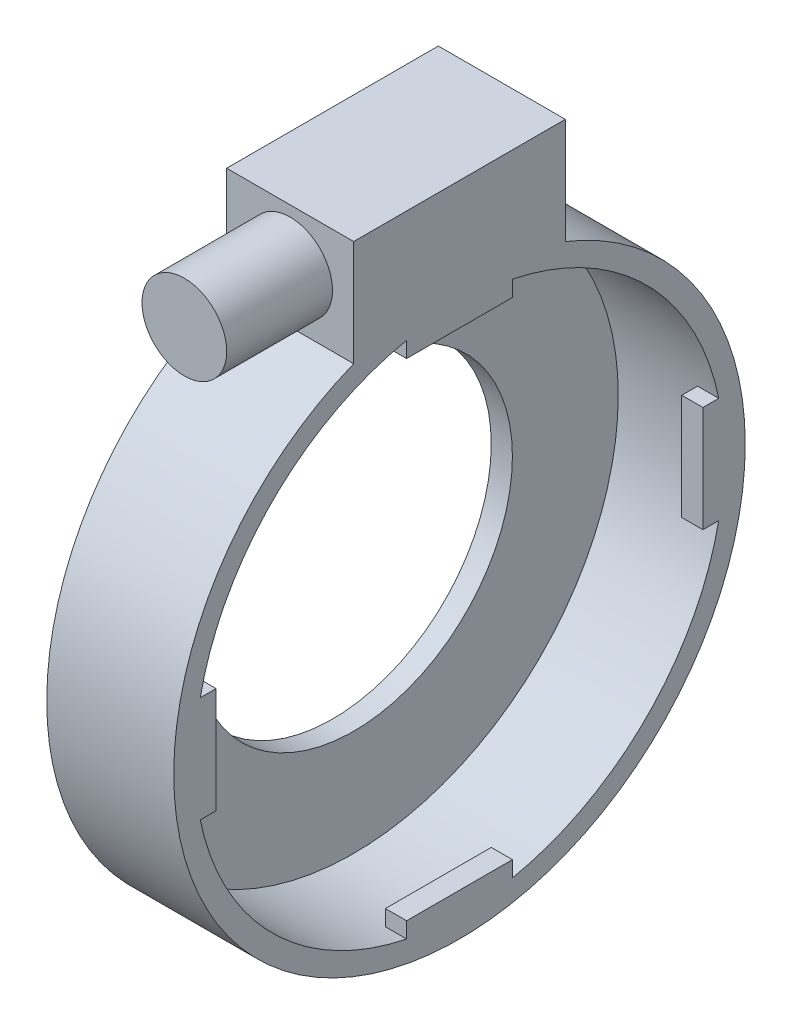
ISO-10303-21;
HEADER;
FILE_DESCRIPTION(('STEP AP214'),'2;1');
FILE_NAME('part.step','',(''),(''),'','','');
FILE_SCHEMA(('AUTOMOTIVE_DESIGN { 1 0 10303 214 1 1 1 1 }'));
ENDSEC;
DATA;
#1=APPLICATION_CONTEXT('core data for automotive mechanical design processes');
#2=APPLICATION_PROTOCOL_DEFINITION('international standard','automotive_design',2000,#1);
#3=PRODUCT_CONTEXT('',#1,'mechanical');
#4=PRODUCT('Part','Part','',(#3));
#5=PRODUCT_RELATED_PRODUCT_CATEGORY('part','',(#4));
#6=PRODUCT_DEFINITION_FORMATION('','',#4);
#7=PRODUCT_DEFINITION_CONTEXT('part definition',#1,'design');
#8=PRODUCT_DEFINITION('design','',#6,#7);
#9=PRODUCT_DEFINITION_SHAPE('','',#8);
#10=(LENGTH_UNIT() NAMED_UNIT(*) SI_UNIT(.MILLI.,.METRE.));
#11=(NAMED_UNIT(*) PLANE_ANGLE_UNIT() SI_UNIT($,.RADIAN.));
#12=(NAMED_UNIT(*) SI_UNIT($,.STERADIAN.) SOLID_ANGLE_UNIT());
#13=UNCERTAINTY_MEASURE_WITH_UNIT(LENGTH_MEASURE(1.E-05),#10,'distance_accuracy_value','');
#14=(GEOMETRIC_REPRESENTATION_CONTEXT(3) GLOBAL_UNCERTAINTY_ASSIGNED_CONTEXT((#13)) GLOBAL_UNIT_ASSIGNED_CONTEXT((#10,
#11,#12)) REPRESENTATION_CONTEXT('',''));
#15=CARTESIAN_POINT('',(0.,0.,0.));
#16=DIRECTION('',(0.,0.,1.));
#17=DIRECTION('',(1.,0.,0.));
#18=AXIS2_PLACEMENT_3D('',#15,#16,#17);
#19=CARTESIAN_POINT('',(12.,0.,0.));
#20=DIRECTION('',(-1.,0.,0.));
#21=DIRECTION('',(0.,0.,1.));
#22=AXIS2_PLACEMENT_3D('',#19,#20,#21);
#23=CYLINDRICAL_SURFACE('',#22,15.);
#24=CARTESIAN_POINT('',(0.,0.,0.));
#25=DIRECTION('',(1.,0.,0.));
#26=DIRECTION('',(0.,0.,-1.));
#27=AXIS2_PLACEMENT_3D('',#24,#25,#26);
#28=CIRCLE('',#27,15.);
#29=CARTESIAN_POINT('',(0.,0.,-15.));
#30=VERTEX_POINT('',#29);
#31=EDGE_CURVE('E312',#30,#30,#28,.T.);
#32=ORIENTED_EDGE('',*,*,#31,.F.);
#33=EDGE_LOOP('',(#32));
#34=FACE_BOUND('',#33,.T.);
#35=CARTESIAN_POINT('',(2.,0.,0.));
#36=DIRECTION('',(1.,0.,0.));
#37=DIRECTION('',(0.,0.,-1.));
#38=AXIS2_PLACEMENT_3D('',#35,#36,#37);
#39=CIRCLE('',#38,15.);
#40=CARTESIAN_POINT('',(2.,0.,-15.));
#41=VERTEX_POINT('',#40);
#42=EDGE_CURVE('E308',#41,#41,#39,.T.);
#43=ORIENTED_EDGE('',*,*,#42,.T.);
#44=EDGE_LOOP('',(#43));
#45=FACE_BOUND('',#44,.T.);
#46=ADVANCED_FACE('F37',(#34,#45),#23,.F.);
#47=CARTESIAN_POINT('',(12.,0.,0.));
#48=DIRECTION('',(1.,0.,0.));
#49=DIRECTION('',(0.,0.,-1.));
#50=AXIS2_PLACEMENT_3D('',#47,#48,#49);
#51=PLANE('',#50);
#52=CARTESIAN_POINT('',(12.,0.,0.));
#53=DIRECTION('',(1.,0.,0.));
#54=DIRECTION('',(0.,0.,-1.));
#55=AXIS2_PLACEMENT_3D('',#52,#53,#54);
#56=CIRCLE('',#55,25.);
#57=CARTESIAN_POINT('',(12.,-5.,24.4948974278318));
#58=VERTEX_POINT('',#57);
#59=CARTESIAN_POINT('',(12.,-24.4948974278318,5.));
#60=VERTEX_POINT('',#59);
#61=EDGE_CURVE('E309',#58,#60,#56,.T.);
#62=ORIENTED_EDGE('',*,*,#61,.F.);
#63=DIRECTION('',(0.,0.,-1.));
#64=VECTOR('',#63,1.);
#65=CARTESIAN_POINT('',(12.,-5.,0.));
#66=LINE('',#65,#64);
#67=CARTESIAN_POINT('',(12.,-5.,23.));
#68=VERTEX_POINT('',#67);
#69=EDGE_CURVE('E275',#58,#68,#66,.T.);
#70=ORIENTED_EDGE('',*,*,#69,.T.);
#71=DIRECTION('',(0.,1.,0.));
#72=VECTOR('',#71,1.);
#73=CARTESIAN_POINT('',(12.,0.,23.));
#74=LINE('',#73,#72);
#75=CARTESIAN_POINT('',(12.,5.,23.));
#76=VERTEX_POINT('',#75);
#77=EDGE_CURVE('E263',#68,#76,#74,.T.);
#78=ORIENTED_EDGE('',*,*,#77,.T.);
#79=DIRECTION('',(0.,0.,1.));
#80=VECTOR('',#79,1.);
#81=CARTESIAN_POINT('',(12.,5.,0.));
#82=LINE('',#81,#80);
#83=CARTESIAN_POINT('',(12.,4.99999999999999,24.4948974278318));
#84=VERTEX_POINT('',#83);
#85=EDGE_CURVE('E287',#76,#84,#82,.T.);
#86=ORIENTED_EDGE('',*,*,#85,.T.);
#87=CARTESIAN_POINT('',(12.,24.4948974278318,5.));
#88=VERTEX_POINT('',#87);
#89=EDGE_CURVE('E304',#88,#84,#56,.T.);
#90=ORIENTED_EDGE('',*,*,#89,.F.);
#91=DIRECTION('',(0.,-1.,0.));
#92=VECTOR('',#91,1.);
#93=CARTESIAN_POINT('',(12.,0.,5.));
#94=LINE('',#93,#92);
#95=CARTESIAN_POINT('',(12.,23.,5.));
#96=VERTEX_POINT('',#95);
#97=EDGE_CURVE('E244',#88,#96,#94,.T.);
#98=ORIENTED_EDGE('',*,*,#97,.T.);
#99=DIRECTION('',(0.,0.,-1.));
#100=VECTOR('',#99,1.);
#101=CARTESIAN_POINT('',(12.,23.,0.));
#102=LINE('',#101,#100);
#103=CARTESIAN_POINT('',(12.,23.,-5.));
#104=VERTEX_POINT('',#103);
#105=EDGE_CURVE('E232',#96,#104,#102,.T.);
#106=ORIENTED_EDGE('',*,*,#105,.T.);
#107=DIRECTION('',(0.,1.,0.));
#108=VECTOR('',#107,1.);
#109=CARTESIAN_POINT('',(12.,0.,-5.));
#110=LINE('',#109,#108);
#111=CARTESIAN_POINT('',(12.,24.4948974278318,-5.));
#112=VERTEX_POINT('',#111);
#113=EDGE_CURVE('E256',#104,#112,#110,.T.);
#114=ORIENTED_EDGE('',*,*,#113,.T.);
#115=CARTESIAN_POINT('',(12.,5.,-24.4948974278318));
#116=VERTEX_POINT('',#115);
#117=EDGE_CURVE('E693',#116,#112,#56,.T.);
#118=ORIENTED_EDGE('',*,*,#117,.F.);
#119=DIRECTION('',(0.,0.,1.));
#120=VECTOR('',#119,1.);
#121=CARTESIAN_POINT('',(12.,5.,0.));
#122=LINE('',#121,#120);
#123=CARTESIAN_POINT('',(12.,5.,-23.));
#124=VERTEX_POINT('',#123);
#125=EDGE_CURVE('E213',#116,#124,#122,.T.);
#126=ORIENTED_EDGE('',*,*,#125,.T.);
#127=DIRECTION('',(0.,-1.,0.));
#128=VECTOR('',#127,1.);
#129=CARTESIAN_POINT('',(12.,0.,-23.));
#130=LINE('',#129,#128);
#131=CARTESIAN_POINT('',(12.,-5.,-23.));
#132=VERTEX_POINT('',#131);
#133=EDGE_CURVE('E205',#124,#132,#130,.T.);
#134=ORIENTED_EDGE('',*,*,#133,.T.);
#135=DIRECTION('',(0.,0.,-1.));
#136=VECTOR('',#135,1.);
#137=CARTESIAN_POINT('',(12.,-5.,0.));
#138=LINE('',#137,#136);
#139=CARTESIAN_POINT('',(12.,-5.,-24.4948974278318));
#140=VERTEX_POINT('',#139);
#141=EDGE_CURVE('E225',#132,#140,#138,.T.);
#142=ORIENTED_EDGE('',*,*,#141,.T.);
#143=CARTESIAN_POINT('',(12.,-24.4948974278318,-5.));
#144=VERTEX_POINT('',#143);
#145=EDGE_CURVE('E311',#144,#140,#56,.T.);
#146=ORIENTED_EDGE('',*,*,#145,.F.);
#147=DIRECTION('',(0.,1.,0.));
#148=VECTOR('',#147,1.);
#149=CARTESIAN_POINT('',(12.,0.,-5.));
#150=LINE('',#149,#148);
#151=CARTESIAN_POINT('',(12.,-23.,-5.));
#152=VERTEX_POINT('',#151);
#153=EDGE_CURVE('E194',#144,#152,#150,.T.);
#154=ORIENTED_EDGE('',*,*,#153,.T.);
#155=DIRECTION('',(0.,0.,1.));
#156=VECTOR('',#155,1.);
#157=CARTESIAN_POINT('',(12.,-23.,0.));
#158=LINE('',#157,#156);
#159=CARTESIAN_POINT('',(12.,-23.,5.));
#160=VERTEX_POINT('',#159);
#161=EDGE_CURVE('E201',#152,#160,#158,.T.);
#162=ORIENTED_EDGE('',*,*,#161,.T.);
#163=DIRECTION('',(0.,-1.,0.));
#164=VECTOR('',#163,1.);
#165=CARTESIAN_POINT('',(12.,0.,5.));
#166=LINE('',#165,#164);
#167=EDGE_CURVE('E178',#160,#60,#166,.T.);
#168=ORIENTED_EDGE('',*,*,#167,.T.);
#169=EDGE_LOOP('',(#62,#70,#78,#86,#90,#98,#106,#114,#118,#126,#134,#142,#146,#154,#162,#168));
#170=FACE_BOUND('',#169,.T.);
#171=CARTESIAN_POINT('',(12.,0.,0.));
#172=DIRECTION('',(1.,0.,0.));
#173=DIRECTION('',(0.,0.,-1.));
#174=AXIS2_PLACEMENT_3D('',#171,#172,#173);
#175=CIRCLE('',#174,27.);
#176=CARTESIAN_POINT('',(12.,25.0798724079689,10.));
#177=VERTEX_POINT('',#176);
#178=CARTESIAN_POINT('',(12.,25.0798724079689,-10.));
#179=VERTEX_POINT('',#178);
#180=EDGE_CURVE('E316',#177,#179,#175,.T.);
#181=ORIENTED_EDGE('',*,*,#180,.T.);
#182=DIRECTION('',(0.,1.,0.));
#183=VECTOR('',#182,1.);
#184=CARTESIAN_POINT('',(12.,25.0798724079689,-10.));
#185=LINE('',#184,#183);
#186=CARTESIAN_POINT('',(12.,35.0798724079689,-10.));
#187=VERTEX_POINT('',#186);
#188=EDGE_CURVE('E319',#179,#187,#185,.T.);
#189=ORIENTED_EDGE('',*,*,#188,.T.);
#190=DIRECTION('',(0.,0.,1.));
#191=VECTOR('',#190,1.);
#192=CARTESIAN_POINT('',(12.,35.0798724079689,10.));
#193=LINE('',#192,#191);
#194=CARTESIAN_POINT('',(12.,35.0798724079689,10.));
#195=VERTEX_POINT('',#194);
#196=EDGE_CURVE('E322',#187,#195,#193,.T.);
#197=ORIENTED_EDGE('',*,*,#196,.T.);
#198=DIRECTION('',(0.,-1.,0.));
#199=VECTOR('',#198,1.);
#200=CARTESIAN_POINT('',(12.,25.0798724079689,10.));
#201=LINE('',#200,#199);
#202=EDGE_CURVE('E324',#195,#177,#201,.T.);
#203=ORIENTED_EDGE('',*,*,#202,.T.);
#204=EDGE_LOOP('',(#181,#189,#197,#203));
#205=FACE_BOUND('',#204,.T.);
#206=ADVANCED_FACE('F366',(#170,#205),#51,.T.);
#207=CARTESIAN_POINT('',(0.,0.,0.));
#208=DIRECTION('',(1.,0.,0.));
#209=DIRECTION('',(0.,0.,-1.));
#210=AXIS2_PLACEMENT_3D('',#207,#208,#209);
#211=PLANE('',#210);
#212=CARTESIAN_POINT('',(0.,0.,0.));
#213=DIRECTION('',(1.,0.,0.));
#214=DIRECTION('',(0.,0.,-1.));
#215=AXIS2_PLACEMENT_3D('',#212,#213,#214);
#216=CIRCLE('',#215,27.);
#217=CARTESIAN_POINT('',(0.,25.0798724079689,10.));
#218=VERTEX_POINT('',#217);
#219=CARTESIAN_POINT('',(0.,25.0798724079689,-10.));
#220=VERTEX_POINT('',#219);
#221=EDGE_CURVE('E315',#218,#220,#216,.T.);
#222=ORIENTED_EDGE('',*,*,#221,.F.);
#223=DIRECTION('',(0.,-1.,0.));
#224=VECTOR('',#223,1.);
#225=CARTESIAN_POINT('',(0.,25.0798724079689,10.));
#226=LINE('',#225,#224);
#227=CARTESIAN_POINT('',(0.,35.0798724079689,10.));
#228=VERTEX_POINT('',#227);
#229=EDGE_CURVE('E320',#228,#218,#226,.T.);
#230=ORIENTED_EDGE('',*,*,#229,.F.);
#231=DIRECTION('',(0.,0.,1.));
#232=VECTOR('',#231,1.);
#233=CARTESIAN_POINT('',(0.,35.0798724079689,10.));
#234=LINE('',#233,#232);
#235=CARTESIAN_POINT('',(0.,35.0798724079689,-10.));
#236=VERTEX_POINT('',#235);
#237=EDGE_CURVE('E331',#236,#228,#234,.T.);
#238=ORIENTED_EDGE('',*,*,#237,.F.);
#239=DIRECTION('',(0.,1.,0.));
#240=VECTOR('',#239,1.);
#241=CARTESIAN_POINT('',(0.,25.0798724079689,-10.));
#242=LINE('',#241,#240);
#243=EDGE_CURVE('E329',#220,#236,#242,.T.);
#244=ORIENTED_EDGE('',*,*,#243,.F.);
#245=EDGE_LOOP('',(#222,#230,#238,#244));
#246=FACE_BOUND('',#245,.T.);
#247=ORIENTED_EDGE('',*,*,#31,.T.);
#248=EDGE_LOOP('',(#247));
#249=FACE_BOUND('',#248,.T.);
#250=ADVANCED_FACE('F371',(#246,#249),#211,.F.);
#251=CARTESIAN_POINT('',(12.,0.,0.));
#252=DIRECTION('',(-1.,0.,0.));
#253=DIRECTION('',(0.,0.,1.));
#254=AXIS2_PLACEMENT_3D('',#251,#252,#253);
#255=CYLINDRICAL_SURFACE('',#254,27.);
#256=ORIENTED_EDGE('',*,*,#221,.T.);
#257=DIRECTION('',(-1.,0.,0.));
#258=VECTOR('',#257,1.);
#259=CARTESIAN_POINT('',(12.,25.0798724079689,-10.));
#260=LINE('',#259,#258);
#261=EDGE_CURVE('E45',#179,#220,#260,.T.);
#262=ORIENTED_EDGE('',*,*,#261,.F.);
#263=ORIENTED_EDGE('',*,*,#180,.F.);
#264=DIRECTION('',(-1.,0.,0.));
#265=VECTOR('',#264,1.);
#266=CARTESIAN_POINT('',(12.,25.0798724079689,10.));
#267=LINE('',#266,#265);
#268=EDGE_CURVE('E326',#177,#218,#267,.T.);
#269=ORIENTED_EDGE('',*,*,#268,.T.);
#270=EDGE_LOOP('',(#256,#262,#263,#269));
#271=FACE_BOUND('',#270,.T.);
#272=ADVANCED_FACE('F39',(#271),#255,.T.);
#273=CARTESIAN_POINT('',(12.,25.0798724079689,-10.));
#274=DIRECTION('',(0.,0.,1.));
#275=DIRECTION('',(1.,0.,0.));
#276=AXIS2_PLACEMENT_3D('',#273,#274,#275);
#277=PLANE('',#276);
#278=ORIENTED_EDGE('',*,*,#243,.T.);
#279=DIRECTION('',(-1.,0.,0.));
#280=VECTOR('',#279,1.);
#281=CARTESIAN_POINT('',(12.,35.0798724079689,-10.));
#282=LINE('',#281,#280);
#283=EDGE_CURVE('E339',#187,#236,#282,.T.);
#284=ORIENTED_EDGE('',*,*,#283,.F.);
#285=ORIENTED_EDGE('',*,*,#188,.F.);
#286=ORIENTED_EDGE('',*,*,#261,.T.);
#287=EDGE_LOOP('',(#278,#284,#285,#286));
#288=FACE_BOUND('',#287,.T.);
#289=ADVANCED_FACE('F380',(#288),#277,.F.);
#290=CARTESIAN_POINT('',(12.,35.0798724079689,10.));
#291=DIRECTION('',(0.,-1.,0.));
#292=DIRECTION('',(0.,0.,-1.));
#293=AXIS2_PLACEMENT_3D('',#290,#291,#292);
#294=PLANE('',#293);
#295=ORIENTED_EDGE('',*,*,#237,.T.);
#296=DIRECTION('',(-1.,0.,0.));
#297=VECTOR('',#296,1.);
#298=CARTESIAN_POINT('',(12.,35.0798724079689,10.));
#299=LINE('',#298,#297);
#300=EDGE_CURVE('E336',#195,#228,#299,.T.);
#301=ORIENTED_EDGE('',*,*,#300,.F.);
#302=ORIENTED_EDGE('',*,*,#196,.F.);
#303=ORIENTED_EDGE('',*,*,#283,.T.);
#304=EDGE_LOOP('',(#295,#301,#302,#303));
#305=FACE_BOUND('',#304,.T.);
#306=ADVANCED_FACE('F361',(#305),#294,.F.);
#307=CARTESIAN_POINT('',(12.,25.0798724079689,10.));
#308=DIRECTION('',(0.,0.,-1.));
#309=DIRECTION('',(-1.,0.,0.));
#310=AXIS2_PLACEMENT_3D('',#307,#308,#309);
#311=PLANE('',#310);
#312=CARTESIAN_POINT('',(6.,30.0798724079689,10.));
#313=DIRECTION('',(0.,0.,-1.));
#314=DIRECTION('',(-1.,0.,0.));
#315=AXIS2_PLACEMENT_3D('',#312,#313,#314);
#316=CIRCLE('',#315,4.);
#317=CARTESIAN_POINT('',(2.,30.0798724079689,10.));
#318=VERTEX_POINT('',#317);
#319=EDGE_CURVE('E11',#318,#318,#316,.F.);
#320=ORIENTED_EDGE('',*,*,#319,.F.);
#321=EDGE_LOOP('',(#320));
#322=FACE_BOUND('',#321,.T.);
#323=ORIENTED_EDGE('',*,*,#229,.T.);
#324=ORIENTED_EDGE('',*,*,#268,.F.);
#325=ORIENTED_EDGE('',*,*,#202,.F.);
#326=ORIENTED_EDGE('',*,*,#300,.T.);
#327=EDGE_LOOP('',(#323,#324,#325,#326));
#328=FACE_BOUND('',#327,.T.);
#329=ADVANCED_FACE('F356',(#322,#328),#311,.F.);
#330=CARTESIAN_POINT('',(2.,0.,0.));
#331=DIRECTION('',(1.,0.,0.));
#332=DIRECTION('',(0.,0.,-1.));
#333=AXIS2_PLACEMENT_3D('',#330,#331,#332);
#334=CYLINDRICAL_SURFACE('',#333,25.);
#335=CARTESIAN_POINT('',(2.,0.,0.));
#336=DIRECTION('',(1.,0.,0.));
#337=DIRECTION('',(0.,0.,-1.));
#338=AXIS2_PLACEMENT_3D('',#335,#336,#337);
#339=CIRCLE('',#338,25.);
#340=CARTESIAN_POINT('',(2.,0.,-25.));
#341=VERTEX_POINT('',#340);
#342=EDGE_CURVE('E305',#341,#341,#339,.T.);
#343=ORIENTED_EDGE('',*,*,#342,.F.);
#344=EDGE_LOOP('',(#343));
#345=FACE_BOUND('',#344,.T.);
#346=CARTESIAN_POINT('',(10.,0.,0.));
#347=DIRECTION('',(1.,0.,0.));
#348=DIRECTION('',(0.,0.,-1.));
#349=AXIS2_PLACEMENT_3D('',#346,#347,#348);
#350=CIRCLE('',#349,25.);
#351=CARTESIAN_POINT('',(10.,-24.4948974278318,-5.));
#352=VERTEX_POINT('',#351);
#353=CARTESIAN_POINT('',(10.,-24.4948974278318,5.));
#354=VERTEX_POINT('',#353);
#355=EDGE_CURVE('E56',#352,#354,#350,.F.);
#356=ORIENTED_EDGE('',*,*,#355,.F.);
#357=DIRECTION('',(1.,0.,0.));
#358=VECTOR('',#357,1.);
#359=CARTESIAN_POINT('',(10.,-24.4948974278318,-5.));
#360=LINE('',#359,#358);
#361=EDGE_CURVE('E206',#352,#144,#360,.T.);
#362=ORIENTED_EDGE('',*,*,#361,.T.);
#363=ORIENTED_EDGE('',*,*,#145,.T.);
#364=DIRECTION('',(1.,0.,0.));
#365=VECTOR('',#364,1.);
#366=CARTESIAN_POINT('',(10.,-5.,-24.4948974278318));
#367=LINE('',#366,#365);
#368=CARTESIAN_POINT('',(10.,-5.,-24.4948974278318));
#369=VERTEX_POINT('',#368);
#370=EDGE_CURVE('E236',#369,#140,#367,.T.);
#371=ORIENTED_EDGE('',*,*,#370,.F.);
#372=CARTESIAN_POINT('',(10.,0.,0.));
#373=DIRECTION('',(1.,0.,0.));
#374=DIRECTION('',(0.,0.,-1.));
#375=AXIS2_PLACEMENT_3D('',#372,#373,#374);
#376=CIRCLE('',#375,25.);
#377=CARTESIAN_POINT('',(10.,5.,-24.4948974278318));
#378=VERTEX_POINT('',#377);
#379=EDGE_CURVE('E216',#378,#369,#376,.F.);
#380=ORIENTED_EDGE('',*,*,#379,.F.);
#381=DIRECTION('',(1.,0.,0.));
#382=VECTOR('',#381,1.);
#383=CARTESIAN_POINT('',(10.,5.,-24.4948974278318));
#384=LINE('',#383,#382);
#385=EDGE_CURVE('E233',#378,#116,#384,.T.);
#386=ORIENTED_EDGE('',*,*,#385,.T.);
#387=ORIENTED_EDGE('',*,*,#117,.T.);
#388=DIRECTION('',(1.,0.,0.));
#389=VECTOR('',#388,1.);
#390=CARTESIAN_POINT('',(10.,24.4948974278318,-5.));
#391=LINE('',#390,#389);
#392=CARTESIAN_POINT('',(10.,24.4948974278318,-5.));
#393=VERTEX_POINT('',#392);
#394=EDGE_CURVE('E267',#393,#112,#391,.T.);
#395=ORIENTED_EDGE('',*,*,#394,.F.);
#396=CARTESIAN_POINT('',(10.,0.,0.));
#397=DIRECTION('',(1.,0.,0.));
#398=DIRECTION('',(0.,0.,-1.));
#399=AXIS2_PLACEMENT_3D('',#396,#397,#398);
#400=CIRCLE('',#399,25.);
#401=CARTESIAN_POINT('',(10.,24.4948974278318,5.));
#402=VERTEX_POINT('',#401);
#403=EDGE_CURVE('E247',#402,#393,#400,.F.);
#404=ORIENTED_EDGE('',*,*,#403,.F.);
#405=DIRECTION('',(1.,0.,0.));
#406=VECTOR('',#405,1.);
#407=CARTESIAN_POINT('',(10.,24.4948974278318,5.));
#408=LINE('',#407,#406);
#409=EDGE_CURVE('E264',#402,#88,#408,.T.);
#410=ORIENTED_EDGE('',*,*,#409,.T.);
#411=ORIENTED_EDGE('',*,*,#89,.T.);
#412=DIRECTION('',(1.,0.,0.));
#413=VECTOR('',#412,1.);
#414=CARTESIAN_POINT('',(10.,5.,24.4948974278318));
#415=LINE('',#414,#413);
#416=CARTESIAN_POINT('',(10.,4.99999999999999,24.4948974278318));
#417=VERTEX_POINT('',#416);
#418=EDGE_CURVE('E298',#417,#84,#415,.T.);
#419=ORIENTED_EDGE('',*,*,#418,.F.);
#420=CARTESIAN_POINT('',(10.,0.,0.));
#421=DIRECTION('',(1.,0.,0.));
#422=DIRECTION('',(0.,0.,-1.));
#423=AXIS2_PLACEMENT_3D('',#420,#421,#422);
#424=CIRCLE('',#423,25.);
#425=CARTESIAN_POINT('',(10.,-5.,24.4948974278318));
#426=VERTEX_POINT('',#425);
#427=EDGE_CURVE('E278',#426,#417,#424,.F.);
#428=ORIENTED_EDGE('',*,*,#427,.F.);
#429=DIRECTION('',(1.,0.,0.));
#430=VECTOR('',#429,1.);
#431=CARTESIAN_POINT('',(10.,-5.,24.4948974278318));
#432=LINE('',#431,#430);
#433=EDGE_CURVE('E295',#426,#58,#432,.T.);
#434=ORIENTED_EDGE('',*,*,#433,.T.);
#435=ORIENTED_EDGE('',*,*,#61,.T.);
#436=DIRECTION('',(1.,0.,0.));
#437=VECTOR('',#436,1.);
#438=CARTESIAN_POINT('',(10.,-24.4948974278318,5.));
#439=LINE('',#438,#437);
#440=EDGE_CURVE('E52',#354,#60,#439,.T.);
#441=ORIENTED_EDGE('',*,*,#440,.F.);
#442=EDGE_LOOP('',(#356,#362,#363,#371,#380,#386,#387,#395,#404,#410,#411,#419,#428,#434,#435,#441));
#443=FACE_BOUND('',#442,.T.);
#444=ADVANCED_FACE('F351',(#345,#443),#334,.F.);
#445=CARTESIAN_POINT('',(2.,0.,0.));
#446=DIRECTION('',(1.,0.,0.));
#447=DIRECTION('',(0.,0.,-1.));
#448=AXIS2_PLACEMENT_3D('',#445,#446,#447);
#449=PLANE('',#448);
#450=ORIENTED_EDGE('',*,*,#42,.F.);
#451=EDGE_LOOP('',(#450));
#452=FACE_BOUND('',#451,.T.);
#453=ORIENTED_EDGE('',*,*,#342,.T.);
#454=EDGE_LOOP('',(#453));
#455=FACE_BOUND('',#454,.T.);
#456=ADVANCED_FACE('F347',(#452,#455),#449,.T.);
#457=CARTESIAN_POINT('',(6.,30.0798724079689,20.));
#458=DIRECTION('',(0.,0.,-1.));
#459=DIRECTION('',(-1.,0.,0.));
#460=AXIS2_PLACEMENT_3D('',#457,#458,#459);
#461=CYLINDRICAL_SURFACE('',#460,4.);
#462=CARTESIAN_POINT('',(6.,30.0798724079689,20.));
#463=DIRECTION('',(0.,0.,1.));
#464=DIRECTION('',(1.,0.,0.));
#465=AXIS2_PLACEMENT_3D('',#462,#463,#464);
#466=CIRCLE('',#465,4.);
#467=CARTESIAN_POINT('',(10.,30.0798724079689,20.));
#468=VERTEX_POINT('',#467);
#469=EDGE_CURVE('E294',#468,#468,#466,.T.);
#470=ORIENTED_EDGE('',*,*,#469,.F.);
#471=EDGE_LOOP('',(#470));
#472=FACE_BOUND('',#471,.T.);
#473=ORIENTED_EDGE('',*,*,#319,.T.);
#474=EDGE_LOOP('',(#473));
#475=FACE_BOUND('',#474,.T.);
#476=ADVANCED_FACE('F350',(#472,#475),#461,.T.);
#477=CARTESIAN_POINT('',(6.,30.0798724079689,20.));
#478=DIRECTION('',(0.,0.,1.));
#479=DIRECTION('',(1.,0.,0.));
#480=AXIS2_PLACEMENT_3D('',#477,#478,#479);
#481=PLANE('',#480);
#482=ORIENTED_EDGE('',*,*,#469,.T.);
#483=EDGE_LOOP('',(#482));
#484=FACE_BOUND('',#483,.T.);
#485=ADVANCED_FACE('F418',(#484),#481,.T.);
#486=CARTESIAN_POINT('',(10.,0.,23.));
#487=DIRECTION('',(0.,0.,-1.));
#488=DIRECTION('',(-1.,0.,0.));
#489=AXIS2_PLACEMENT_3D('',#486,#487,#488);
#490=PLANE('',#489);
#491=ORIENTED_EDGE('',*,*,#77,.F.);
#492=DIRECTION('',(1.,0.,0.));
#493=VECTOR('',#492,1.);
#494=CARTESIAN_POINT('',(10.,-5.,23.));
#495=LINE('',#494,#493);
#496=CARTESIAN_POINT('',(10.,-5.,23.));
#497=VERTEX_POINT('',#496);
#498=EDGE_CURVE('E292',#497,#68,#495,.T.);
#499=ORIENTED_EDGE('',*,*,#498,.F.);
#500=DIRECTION('',(0.,1.,0.));
#501=VECTOR('',#500,1.);
#502=CARTESIAN_POINT('',(10.,0.,23.));
#503=LINE('',#502,#501);
#504=CARTESIAN_POINT('',(10.,5.,23.));
#505=VERTEX_POINT('',#504);
#506=EDGE_CURVE('E271',#497,#505,#503,.T.);
#507=ORIENTED_EDGE('',*,*,#506,.T.);
#508=DIRECTION('',(1.,0.,0.));
#509=VECTOR('',#508,1.);
#510=CARTESIAN_POINT('',(10.,5.,23.));
#511=LINE('',#510,#509);
#512=EDGE_CURVE('E284',#505,#76,#511,.T.);
#513=ORIENTED_EDGE('',*,*,#512,.T.);
#514=EDGE_LOOP('',(#491,#499,#507,#513));
#515=FACE_BOUND('',#514,.T.);
#516=ADVANCED_FACE('F431',(#515),#490,.T.);
#517=CARTESIAN_POINT('',(10.,-5.,0.));
#518=DIRECTION('',(0.,-1.,0.));
#519=DIRECTION('',(0.,0.,-1.));
#520=AXIS2_PLACEMENT_3D('',#517,#518,#519);
#521=PLANE('',#520);
#522=ORIENTED_EDGE('',*,*,#69,.F.);
#523=ORIENTED_EDGE('',*,*,#433,.F.);
#524=DIRECTION('',(0.,0.,-1.));
#525=VECTOR('',#524,1.);
#526=CARTESIAN_POINT('',(10.,-5.,0.));
#527=LINE('',#526,#525);
#528=EDGE_CURVE('E281',#426,#497,#527,.T.);
#529=ORIENTED_EDGE('',*,*,#528,.T.);
#530=ORIENTED_EDGE('',*,*,#498,.T.);
#531=EDGE_LOOP('',(#522,#523,#529,#530));
#532=FACE_BOUND('',#531,.T.);
#533=ADVANCED_FACE('F435',(#532),#521,.T.);
#534=CARTESIAN_POINT('',(10.,5.,0.));
#535=DIRECTION('',(0.,1.,0.));
#536=DIRECTION('',(0.,0.,1.));
#537=AXIS2_PLACEMENT_3D('',#534,#535,#536);
#538=PLANE('',#537);
#539=ORIENTED_EDGE('',*,*,#85,.F.);
#540=ORIENTED_EDGE('',*,*,#512,.F.);
#541=DIRECTION('',(0.,0.,1.));
#542=VECTOR('',#541,1.);
#543=CARTESIAN_POINT('',(10.,5.,0.));
#544=LINE('',#543,#542);
#545=EDGE_CURVE('E274',#505,#417,#544,.T.);
#546=ORIENTED_EDGE('',*,*,#545,.T.);
#547=ORIENTED_EDGE('',*,*,#418,.T.);
#548=EDGE_LOOP('',(#539,#540,#546,#547));
#549=FACE_BOUND('',#548,.T.);
#550=ADVANCED_FACE('F446',(#549),#538,.T.);
#551=CARTESIAN_POINT('',(10.,0.,0.));
#552=DIRECTION('',(1.,0.,0.));
#553=DIRECTION('',(0.,0.,-1.));
#554=AXIS2_PLACEMENT_3D('',#551,#552,#553);
#555=PLANE('',#554);
#556=ORIENTED_EDGE('',*,*,#506,.F.);
#557=ORIENTED_EDGE('',*,*,#528,.F.);
#558=ORIENTED_EDGE('',*,*,#427,.T.);
#559=ORIENTED_EDGE('',*,*,#545,.F.);
#560=EDGE_LOOP('',(#556,#557,#558,#559));
#561=FACE_BOUND('',#560,.T.);
#562=ADVANCED_FACE('F457',(#561),#555,.F.);
#563=CARTESIAN_POINT('',(10.,23.,0.));
#564=DIRECTION('',(0.,-1.,0.));
#565=DIRECTION('',(0.,0.,-1.));
#566=AXIS2_PLACEMENT_3D('',#563,#564,#565);
#567=PLANE('',#566);
#568=ORIENTED_EDGE('',*,*,#105,.F.);
#569=DIRECTION('',(1.,0.,0.));
#570=VECTOR('',#569,1.);
#571=CARTESIAN_POINT('',(10.,23.,5.));
#572=LINE('',#571,#570);
#573=CARTESIAN_POINT('',(10.,23.,5.));
#574=VERTEX_POINT('',#573);
#575=EDGE_CURVE('E261',#574,#96,#572,.T.);
#576=ORIENTED_EDGE('',*,*,#575,.F.);
#577=DIRECTION('',(0.,0.,-1.));
#578=VECTOR('',#577,1.);
#579=CARTESIAN_POINT('',(10.,23.,0.));
#580=LINE('',#579,#578);
#581=CARTESIAN_POINT('',(10.,23.,-5.));
#582=VERTEX_POINT('',#581);
#583=EDGE_CURVE('E240',#574,#582,#580,.T.);
#584=ORIENTED_EDGE('',*,*,#583,.T.);
#585=DIRECTION('',(1.,0.,0.));
#586=VECTOR('',#585,1.);
#587=CARTESIAN_POINT('',(10.,23.,-5.));
#588=LINE('',#587,#586);
#589=EDGE_CURVE('E253',#582,#104,#588,.T.);
#590=ORIENTED_EDGE('',*,*,#589,.T.);
#591=EDGE_LOOP('',(#568,#576,#584,#590));
#592=FACE_BOUND('',#591,.T.);
#593=ADVANCED_FACE('F468',(#592),#567,.T.);
#594=CARTESIAN_POINT('',(10.,0.,5.));
#595=DIRECTION('',(0.,0.,1.));
#596=DIRECTION('',(1.,0.,0.));
#597=AXIS2_PLACEMENT_3D('',#594,#595,#596);
#598=PLANE('',#597);
#599=ORIENTED_EDGE('',*,*,#97,.F.);
#600=ORIENTED_EDGE('',*,*,#409,.F.);
#601=DIRECTION('',(0.,-1.,0.));
#602=VECTOR('',#601,1.);
#603=CARTESIAN_POINT('',(10.,0.,5.));
#604=LINE('',#603,#602);
#605=EDGE_CURVE('E250',#402,#574,#604,.T.);
#606=ORIENTED_EDGE('',*,*,#605,.T.);
#607=ORIENTED_EDGE('',*,*,#575,.T.);
#608=EDGE_LOOP('',(#599,#600,#606,#607));
#609=FACE_BOUND('',#608,.T.);
#610=ADVANCED_FACE('F479',(#609),#598,.T.);
#611=CARTESIAN_POINT('',(10.,0.,-5.));
#612=DIRECTION('',(0.,0.,-1.));
#613=DIRECTION('',(-1.,0.,0.));
#614=AXIS2_PLACEMENT_3D('',#611,#612,#613);
#615=PLANE('',#614);
#616=ORIENTED_EDGE('',*,*,#113,.F.);
#617=ORIENTED_EDGE('',*,*,#589,.F.);
#618=DIRECTION('',(0.,1.,0.));
#619=VECTOR('',#618,1.);
#620=CARTESIAN_POINT('',(10.,0.,-5.));
#621=LINE('',#620,#619);
#622=EDGE_CURVE('E243',#582,#393,#621,.T.);
#623=ORIENTED_EDGE('',*,*,#622,.T.);
#624=ORIENTED_EDGE('',*,*,#394,.T.);
#625=EDGE_LOOP('',(#616,#617,#623,#624));
#626=FACE_BOUND('',#625,.T.);
#627=ADVANCED_FACE('F490',(#626),#615,.T.);
#628=CARTESIAN_POINT('',(10.,0.,0.));
#629=DIRECTION('',(1.,0.,0.));
#630=DIRECTION('',(0.,0.,-1.));
#631=AXIS2_PLACEMENT_3D('',#628,#629,#630);
#632=PLANE('',#631);
#633=ORIENTED_EDGE('',*,*,#583,.F.);
#634=ORIENTED_EDGE('',*,*,#605,.F.);
#635=ORIENTED_EDGE('',*,*,#403,.T.);
#636=ORIENTED_EDGE('',*,*,#622,.F.);
#637=EDGE_LOOP('',(#633,#634,#635,#636));
#638=FACE_BOUND('',#637,.T.);
#639=ADVANCED_FACE('F501',(#638),#632,.F.);
#640=CARTESIAN_POINT('',(10.,0.,-23.));
#641=DIRECTION('',(0.,0.,1.));
#642=DIRECTION('',(1.,0.,0.));
#643=AXIS2_PLACEMENT_3D('',#640,#641,#642);
#644=PLANE('',#643);
#645=ORIENTED_EDGE('',*,*,#133,.F.);
#646=DIRECTION('',(1.,0.,0.));
#647=VECTOR('',#646,1.);
#648=CARTESIAN_POINT('',(10.,5.,-23.));
#649=LINE('',#648,#647);
#650=CARTESIAN_POINT('',(10.,5.,-23.));
#651=VERTEX_POINT('',#650);
#652=EDGE_CURVE('E230',#651,#124,#649,.T.);
#653=ORIENTED_EDGE('',*,*,#652,.F.);
#654=DIRECTION('',(0.,-1.,0.));
#655=VECTOR('',#654,1.);
#656=CARTESIAN_POINT('',(10.,0.,-23.));
#657=LINE('',#656,#655);
#658=CARTESIAN_POINT('',(10.,-5.,-23.));
#659=VERTEX_POINT('',#658);
#660=EDGE_CURVE('E209',#651,#659,#657,.T.);
#661=ORIENTED_EDGE('',*,*,#660,.T.);
#662=DIRECTION('',(1.,0.,0.));
#663=VECTOR('',#662,1.);
#664=CARTESIAN_POINT('',(10.,-5.,-23.));
#665=LINE('',#664,#663);
#666=EDGE_CURVE('E222',#659,#132,#665,.T.);
#667=ORIENTED_EDGE('',*,*,#666,.T.);
#668=EDGE_LOOP('',(#645,#653,#661,#667));
#669=FACE_BOUND('',#668,.T.);
#670=ADVANCED_FACE('F512',(#669),#644,.T.);
#671=CARTESIAN_POINT('',(10.,5.,0.));
#672=DIRECTION('',(0.,1.,0.));
#673=DIRECTION('',(0.,0.,1.));
#674=AXIS2_PLACEMENT_3D('',#671,#672,#673);
#675=PLANE('',#674);
#676=ORIENTED_EDGE('',*,*,#125,.F.);
#677=ORIENTED_EDGE('',*,*,#385,.F.);
#678=DIRECTION('',(0.,0.,1.));
#679=VECTOR('',#678,1.);
#680=CARTESIAN_POINT('',(10.,5.,0.));
#681=LINE('',#680,#679);
#682=EDGE_CURVE('E219',#378,#651,#681,.T.);
#683=ORIENTED_EDGE('',*,*,#682,.T.);
#684=ORIENTED_EDGE('',*,*,#652,.T.);
#685=EDGE_LOOP('',(#676,#677,#683,#684));
#686=FACE_BOUND('',#685,.T.);
#687=ADVANCED_FACE('F523',(#686),#675,.T.);
#688=CARTESIAN_POINT('',(10.,-5.,0.));
#689=DIRECTION('',(0.,-1.,0.));
#690=DIRECTION('',(0.,0.,-1.));
#691=AXIS2_PLACEMENT_3D('',#688,#689,#690);
#692=PLANE('',#691);
#693=ORIENTED_EDGE('',*,*,#141,.F.);
#694=ORIENTED_EDGE('',*,*,#666,.F.);
#695=DIRECTION('',(0.,0.,-1.));
#696=VECTOR('',#695,1.);
#697=CARTESIAN_POINT('',(10.,-5.,0.));
#698=LINE('',#697,#696);
#699=EDGE_CURVE('E212',#659,#369,#698,.T.);
#700=ORIENTED_EDGE('',*,*,#699,.T.);
#701=ORIENTED_EDGE('',*,*,#370,.T.);
#702=EDGE_LOOP('',(#693,#694,#700,#701));
#703=FACE_BOUND('',#702,.T.);
#704=ADVANCED_FACE('F534',(#703),#692,.T.);
#705=CARTESIAN_POINT('',(10.,0.,0.));
#706=DIRECTION('',(1.,0.,0.));
#707=DIRECTION('',(0.,0.,-1.));
#708=AXIS2_PLACEMENT_3D('',#705,#706,#707);
#709=PLANE('',#708);
#710=ORIENTED_EDGE('',*,*,#660,.F.);
#711=ORIENTED_EDGE('',*,*,#682,.F.);
#712=ORIENTED_EDGE('',*,*,#379,.T.);
#713=ORIENTED_EDGE('',*,*,#699,.F.);
#714=EDGE_LOOP('',(#710,#711,#712,#713));
#715=FACE_BOUND('',#714,.T.);
#716=ADVANCED_FACE('F545',(#715),#709,.F.);
#717=CARTESIAN_POINT('',(10.,-23.,0.));
#718=DIRECTION('',(0.,1.,0.));
#719=DIRECTION('',(0.,0.,1.));
#720=AXIS2_PLACEMENT_3D('',#717,#718,#719);
#721=PLANE('',#720);
#722=ORIENTED_EDGE('',*,*,#161,.F.);
#723=DIRECTION('',(1.,0.,0.));
#724=VECTOR('',#723,1.);
#725=CARTESIAN_POINT('',(10.,-23.,-5.));
#726=LINE('',#725,#724);
#727=CARTESIAN_POINT('',(10.,-23.,-5.));
#728=VERTEX_POINT('',#727);
#729=EDGE_CURVE('E193',#728,#152,#726,.T.);
#730=ORIENTED_EDGE('',*,*,#729,.F.);
#731=DIRECTION('',(0.,0.,1.));
#732=VECTOR('',#731,1.);
#733=CARTESIAN_POINT('',(10.,-23.,0.));
#734=LINE('',#733,#732);
#735=CARTESIAN_POINT('',(10.,-23.,5.));
#736=VERTEX_POINT('',#735);
#737=EDGE_CURVE('E189',#728,#736,#734,.T.);
#738=ORIENTED_EDGE('',*,*,#737,.T.);
#739=DIRECTION('',(1.,0.,0.));
#740=VECTOR('',#739,1.);
#741=CARTESIAN_POINT('',(10.,-23.,5.));
#742=LINE('',#741,#740);
#743=EDGE_CURVE('E173',#736,#160,#742,.T.);
#744=ORIENTED_EDGE('',*,*,#743,.T.);
#745=EDGE_LOOP('',(#722,#730,#738,#744));
#746=FACE_BOUND('',#745,.T.);
#747=ADVANCED_FACE('F192',(#746),#721,.T.);
#748=CARTESIAN_POINT('',(10.,0.,-5.));
#749=DIRECTION('',(0.,0.,-1.));
#750=DIRECTION('',(-1.,0.,0.));
#751=AXIS2_PLACEMENT_3D('',#748,#749,#750);
#752=PLANE('',#751);
#753=ORIENTED_EDGE('',*,*,#153,.F.);
#754=ORIENTED_EDGE('',*,*,#361,.F.);
#755=DIRECTION('',(0.,1.,0.));
#756=VECTOR('',#755,1.);
#757=CARTESIAN_POINT('',(10.,0.,-5.));
#758=LINE('',#757,#756);
#759=EDGE_CURVE('E183',#352,#728,#758,.T.);
#760=ORIENTED_EDGE('',*,*,#759,.T.);
#761=ORIENTED_EDGE('',*,*,#729,.T.);
#762=EDGE_LOOP('',(#753,#754,#760,#761));
#763=FACE_BOUND('',#762,.T.);
#764=ADVANCED_FACE('F566',(#763),#752,.T.);
#765=CARTESIAN_POINT('',(10.,0.,5.));
#766=DIRECTION('',(0.,0.,1.));
#767=DIRECTION('',(1.,0.,0.));
#768=AXIS2_PLACEMENT_3D('',#765,#766,#767);
#769=PLANE('',#768);
#770=ORIENTED_EDGE('',*,*,#167,.F.);
#771=ORIENTED_EDGE('',*,*,#743,.F.);
#772=DIRECTION('',(0.,-1.,0.));
#773=VECTOR('',#772,1.);
#774=CARTESIAN_POINT('',(10.,0.,5.));
#775=LINE('',#774,#773);
#776=EDGE_CURVE('E176',#736,#354,#775,.T.);
#777=ORIENTED_EDGE('',*,*,#776,.T.);
#778=ORIENTED_EDGE('',*,*,#440,.T.);
#779=EDGE_LOOP('',(#770,#771,#777,#778));
#780=FACE_BOUND('',#779,.T.);
#781=ADVANCED_FACE('F175',(#780),#769,.T.);
#782=CARTESIAN_POINT('',(10.,0.,0.));
#783=DIRECTION('',(1.,0.,0.));
#784=DIRECTION('',(0.,0.,-1.));
#785=AXIS2_PLACEMENT_3D('',#782,#783,#784);
#786=PLANE('',#785);
#787=ORIENTED_EDGE('',*,*,#737,.F.);
#788=ORIENTED_EDGE('',*,*,#759,.F.);
#789=ORIENTED_EDGE('',*,*,#355,.T.);
#790=ORIENTED_EDGE('',*,*,#776,.F.);
#791=EDGE_LOOP('',(#787,#788,#789,#790));
#792=FACE_BOUND('',#791,.T.);
#793=ADVANCED_FACE('F187',(#792),#786,.F.);
#794=CLOSED_SHELL('',(#46,#206,#250,#272,#289,#306,#329,#444,#456,#476,#485,#516,#533,#550,#562,
#593,#610,#627,#639,#670,#687,#704,#716,#747,#764,#781,#793));
#795=MANIFOLD_SOLID_BREP('B2',#794);
#796=ADVANCED_BREP_SHAPE_REPRESENTATION('',(#18,#795),#14);
#797=SHAPE_DEFINITION_REPRESENTATION(#9,#796);
ENDSEC;
END-ISO-10303-21;
